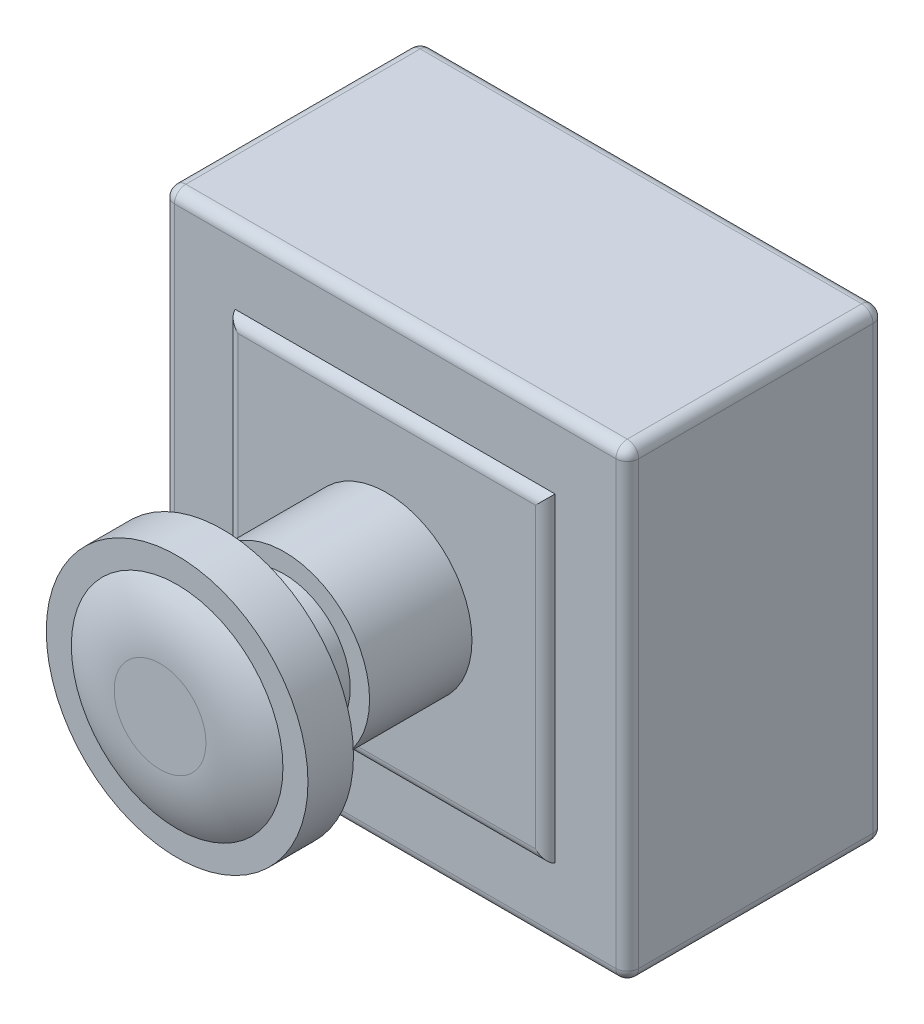
ISO-10303-21;
HEADER;
FILE_DESCRIPTION(('STEP AP214'),'2;1');
FILE_NAME('part.step','',(''),(''),'','','');
FILE_SCHEMA(('AUTOMOTIVE_DESIGN { 1 0 10303 214 1 1 1 1 }'));
ENDSEC;
DATA;
#1=APPLICATION_CONTEXT('core data for automotive mechanical design processes');
#2=APPLICATION_PROTOCOL_DEFINITION('international standard','automotive_design',2000,#1);
#3=PRODUCT_CONTEXT('',#1,'mechanical');
#4=PRODUCT('Part','Part','',(#3));
#5=PRODUCT_RELATED_PRODUCT_CATEGORY('part','',(#4));
#6=PRODUCT_DEFINITION_FORMATION('','',#4);
#7=PRODUCT_DEFINITION_CONTEXT('part definition',#1,'design');
#8=PRODUCT_DEFINITION('design','',#6,#7);
#9=PRODUCT_DEFINITION_SHAPE('','',#8);
#10=(LENGTH_UNIT() NAMED_UNIT(*) SI_UNIT(.MILLI.,.METRE.));
#11=(NAMED_UNIT(*) PLANE_ANGLE_UNIT() SI_UNIT($,.RADIAN.));
#12=(NAMED_UNIT(*) SI_UNIT($,.STERADIAN.) SOLID_ANGLE_UNIT());
#13=UNCERTAINTY_MEASURE_WITH_UNIT(LENGTH_MEASURE(1.E-05),#10,'distance_accuracy_value','');
#14=(GEOMETRIC_REPRESENTATION_CONTEXT(3) GLOBAL_UNCERTAINTY_ASSIGNED_CONTEXT((#13)) GLOBAL_UNIT_ASSIGNED_CONTEXT((#10,
#11,#12)) REPRESENTATION_CONTEXT('',''));
#15=CARTESIAN_POINT('',(0.,0.,0.));
#16=DIRECTION('',(0.,0.,1.));
#17=DIRECTION('',(1.,0.,0.));
#18=AXIS2_PLACEMENT_3D('',#15,#16,#17);
#19=CARTESIAN_POINT('',(0.,0.,28.05));
#20=DIRECTION('',(0.,0.,-1.));
#21=DIRECTION('',(-1.,0.,0.));
#22=AXIS2_PLACEMENT_3D('',#19,#20,#21);
#23=CYLINDRICAL_SURFACE('',#22,5.8);
#24=CARTESIAN_POINT('',(0.,0.,21.05));
#25=DIRECTION('',(0.,0.,1.));
#26=DIRECTION('',(1.,0.,0.));
#27=AXIS2_PLACEMENT_3D('',#24,#25,#26);
#28=CIRCLE('',#27,5.8);
#29=CARTESIAN_POINT('',(5.8,0.,21.05));
#30=VERTEX_POINT('',#29);
#31=EDGE_CURVE('E203',#30,#30,#28,.T.);
#32=ORIENTED_EDGE('',*,*,#31,.T.);
#33=EDGE_LOOP('',(#32));
#34=FACE_BOUND('',#33,.T.);
#35=CARTESIAN_POINT('',(0.,0.,26.05));
#36=DIRECTION('',(0.,0.,1.));
#37=DIRECTION('',(1.,0.,0.));
#38=AXIS2_PLACEMENT_3D('',#35,#36,#37);
#39=CIRCLE('',#38,5.8);
#40=CARTESIAN_POINT('',(5.8,0.,26.05));
#41=VERTEX_POINT('',#40);
#42=EDGE_CURVE('E212',#41,#41,#39,.T.);
#43=ORIENTED_EDGE('',*,*,#42,.F.);
#44=EDGE_LOOP('',(#43));
#45=FACE_BOUND('',#44,.T.);
#46=ADVANCED_FACE('F41',(#34,#45),#23,.T.);
#47=CARTESIAN_POINT('',(0.,0.,11.3));
#48=DIRECTION('',(0.,0.,1.));
#49=DIRECTION('',(1.,0.,0.));
#50=AXIS2_PLACEMENT_3D('',#47,#48,#49);
#51=PLANE('',#50);
#52=DIRECTION('',(0.,-1.,0.));
#53=VECTOR('',#52,1.);
#54=CARTESIAN_POINT('',(-19.4,-20.4,11.3));
#55=LINE('',#54,#53);
#56=CARTESIAN_POINT('',(-19.4,19.4,11.3));
#57=VERTEX_POINT('',#56);
#58=CARTESIAN_POINT('',(-19.4,-19.4,11.3));
#59=VERTEX_POINT('',#58);
#60=EDGE_CURVE('E236',#57,#59,#55,.T.);
#61=ORIENTED_EDGE('',*,*,#60,.T.);
#62=DIRECTION('',(1.,0.,0.));
#63=VECTOR('',#62,1.);
#64=CARTESIAN_POINT('',(20.4,-19.4,11.3));
#65=LINE('',#64,#63);
#66=CARTESIAN_POINT('',(19.4,-19.4,11.3));
#67=VERTEX_POINT('',#66);
#68=EDGE_CURVE('E239',#59,#67,#65,.T.);
#69=ORIENTED_EDGE('',*,*,#68,.T.);
#70=DIRECTION('',(0.,1.,0.));
#71=VECTOR('',#70,1.);
#72=CARTESIAN_POINT('',(19.4,20.4,11.3));
#73=LINE('',#72,#71);
#74=CARTESIAN_POINT('',(19.4,19.4,11.3));
#75=VERTEX_POINT('',#74);
#76=EDGE_CURVE('E230',#67,#75,#73,.T.);
#77=ORIENTED_EDGE('',*,*,#76,.T.);
#78=DIRECTION('',(-1.,0.,0.));
#79=VECTOR('',#78,1.);
#80=CARTESIAN_POINT('',(-20.4,19.4,11.3));
#81=LINE('',#80,#79);
#82=EDGE_CURVE('E233',#75,#57,#81,.T.);
#83=ORIENTED_EDGE('',*,*,#82,.T.);
#84=EDGE_LOOP('',(#61,#69,#77,#83));
#85=FACE_BOUND('',#84,.T.);
#86=DIRECTION('',(1.,0.,0.));
#87=VECTOR('',#86,1.);
#88=CARTESIAN_POINT('',(0.,14.05,11.3));
#89=LINE('',#88,#87);
#90=CARTESIAN_POINT('',(-14.05,14.05,11.3));
#91=VERTEX_POINT('',#90);
#92=CARTESIAN_POINT('',(14.05,14.05,11.3));
#93=VERTEX_POINT('',#92);
#94=EDGE_CURVE('E185',#91,#93,#89,.T.);
#95=ORIENTED_EDGE('',*,*,#94,.T.);
#96=DIRECTION('',(0.,-1.,0.));
#97=VECTOR('',#96,1.);
#98=CARTESIAN_POINT('',(14.05,0.,11.3));
#99=LINE('',#98,#97);
#100=CARTESIAN_POINT('',(14.05,-14.05,11.3));
#101=VERTEX_POINT('',#100);
#102=EDGE_CURVE('E163',#93,#101,#99,.T.);
#103=ORIENTED_EDGE('',*,*,#102,.T.);
#104=DIRECTION('',(-1.,0.,0.));
#105=VECTOR('',#104,1.);
#106=CARTESIAN_POINT('',(0.,-14.05,11.3));
#107=LINE('',#106,#105);
#108=CARTESIAN_POINT('',(-14.05,-14.05,11.3));
#109=VERTEX_POINT('',#108);
#110=EDGE_CURVE('E174',#101,#109,#107,.T.);
#111=ORIENTED_EDGE('',*,*,#110,.T.);
#112=DIRECTION('',(0.,1.,0.));
#113=VECTOR('',#112,1.);
#114=CARTESIAN_POINT('',(-14.05,0.,11.3));
#115=LINE('',#114,#113);
#116=EDGE_CURVE('E181',#109,#91,#115,.T.);
#117=ORIENTED_EDGE('',*,*,#116,.T.);
#118=EDGE_LOOP('',(#95,#103,#111,#117));
#119=FACE_BOUND('',#118,.T.);
#120=ADVANCED_FACE('F183',(#85,#119),#51,.T.);
#121=CARTESIAN_POINT('',(20.4,20.4,11.3));
#122=DIRECTION('',(-1.,0.,0.));
#123=DIRECTION('',(0.,-1.,0.));
#124=AXIS2_PLACEMENT_3D('',#121,#122,#123);
#125=PLANE('',#124);
#126=DIRECTION('',(0.,1.,0.));
#127=VECTOR('',#126,1.);
#128=CARTESIAN_POINT('',(20.4,-20.4,10.3));
#129=LINE('',#128,#127);
#130=CARTESIAN_POINT('',(20.4,19.4,10.3));
#131=VERTEX_POINT('',#130);
#132=CARTESIAN_POINT('',(20.4,-19.4,10.3));
#133=VERTEX_POINT('',#132);
#134=EDGE_CURVE('E288',#131,#133,#129,.F.);
#135=ORIENTED_EDGE('',*,*,#134,.T.);
#136=DIRECTION('',(0.,0.,-1.));
#137=VECTOR('',#136,1.);
#138=CARTESIAN_POINT('',(20.4,-19.4,11.3));
#139=LINE('',#138,#137);
#140=CARTESIAN_POINT('',(20.4,-19.4,-10.3));
#141=VERTEX_POINT('',#140);
#142=EDGE_CURVE('E292',#133,#141,#139,.T.);
#143=ORIENTED_EDGE('',*,*,#142,.T.);
#144=DIRECTION('',(0.,1.,0.));
#145=VECTOR('',#144,1.);
#146=CARTESIAN_POINT('',(20.4,20.4,-10.3));
#147=LINE('',#146,#145);
#148=CARTESIAN_POINT('',(20.4,19.4,-10.3));
#149=VERTEX_POINT('',#148);
#150=EDGE_CURVE('E285',#141,#149,#147,.T.);
#151=ORIENTED_EDGE('',*,*,#150,.T.);
#152=DIRECTION('',(0.,0.,-1.));
#153=VECTOR('',#152,1.);
#154=CARTESIAN_POINT('',(20.4,19.4,11.3));
#155=LINE('',#154,#153);
#156=EDGE_CURVE('E282',#149,#131,#155,.F.);
#157=ORIENTED_EDGE('',*,*,#156,.T.);
#158=EDGE_LOOP('',(#135,#143,#151,#157));
#159=FACE_BOUND('',#158,.T.);
#160=ADVANCED_FACE('F445',(#159),#125,.F.);
#161=CARTESIAN_POINT('',(-20.4,20.4,11.3));
#162=DIRECTION('',(0.,-1.,0.));
#163=DIRECTION('',(0.,0.,-1.));
#164=AXIS2_PLACEMENT_3D('',#161,#162,#163);
#165=PLANE('',#164);
#166=DIRECTION('',(-1.,0.,0.));
#167=VECTOR('',#166,1.);
#168=CARTESIAN_POINT('',(20.4,20.4,10.3));
#169=LINE('',#168,#167);
#170=CARTESIAN_POINT('',(-19.4,20.4,10.3));
#171=VERTEX_POINT('',#170);
#172=CARTESIAN_POINT('',(19.4,20.4,10.3));
#173=VERTEX_POINT('',#172);
#174=EDGE_CURVE('E275',#171,#173,#169,.F.);
#175=ORIENTED_EDGE('',*,*,#174,.T.);
#176=DIRECTION('',(0.,0.,-1.));
#177=VECTOR('',#176,1.);
#178=CARTESIAN_POINT('',(19.4,20.4,11.3));
#179=LINE('',#178,#177);
#180=CARTESIAN_POINT('',(19.4,20.4,-10.3));
#181=VERTEX_POINT('',#180);
#182=EDGE_CURVE('E279',#173,#181,#179,.T.);
#183=ORIENTED_EDGE('',*,*,#182,.T.);
#184=DIRECTION('',(-1.,0.,0.));
#185=VECTOR('',#184,1.);
#186=CARTESIAN_POINT('',(-20.4,20.4,-10.3));
#187=LINE('',#186,#185);
#188=CARTESIAN_POINT('',(-19.4,20.4,-10.3));
#189=VERTEX_POINT('',#188);
#190=EDGE_CURVE('E272',#181,#189,#187,.T.);
#191=ORIENTED_EDGE('',*,*,#190,.T.);
#192=DIRECTION('',(0.,0.,-1.));
#193=VECTOR('',#192,1.);
#194=CARTESIAN_POINT('',(-19.4,20.4,11.3));
#195=LINE('',#194,#193);
#196=EDGE_CURVE('E269',#189,#171,#195,.F.);
#197=ORIENTED_EDGE('',*,*,#196,.T.);
#198=EDGE_LOOP('',(#175,#183,#191,#197));
#199=FACE_BOUND('',#198,.T.);
#200=ADVANCED_FACE('F561',(#199),#165,.F.);
#201=CARTESIAN_POINT('',(-20.4,20.4,11.3));
#202=DIRECTION('',(1.,0.,0.));
#203=DIRECTION('',(0.,1.,0.));
#204=AXIS2_PLACEMENT_3D('',#201,#202,#203);
#205=PLANE('',#204);
#206=DIRECTION('',(0.,-1.,0.));
#207=VECTOR('',#206,1.);
#208=CARTESIAN_POINT('',(-20.4,20.4,-10.3));
#209=LINE('',#208,#207);
#210=CARTESIAN_POINT('',(-20.4,19.4,-10.3));
#211=VERTEX_POINT('',#210);
#212=CARTESIAN_POINT('',(-20.4,-19.4,-10.3));
#213=VERTEX_POINT('',#212);
#214=EDGE_CURVE('E259',#211,#213,#209,.T.);
#215=ORIENTED_EDGE('',*,*,#214,.T.);
#216=DIRECTION('',(0.,0.,-1.));
#217=VECTOR('',#216,1.);
#218=CARTESIAN_POINT('',(-20.4,-19.4,11.3));
#219=LINE('',#218,#217);
#220=CARTESIAN_POINT('',(-20.4,-19.4,10.3));
#221=VERTEX_POINT('',#220);
#222=EDGE_CURVE('E266',#213,#221,#219,.F.);
#223=ORIENTED_EDGE('',*,*,#222,.T.);
#224=DIRECTION('',(0.,-1.,0.));
#225=VECTOR('',#224,1.);
#226=CARTESIAN_POINT('',(-20.4,20.4,10.3));
#227=LINE('',#226,#225);
#228=CARTESIAN_POINT('',(-20.4,19.4,10.3));
#229=VERTEX_POINT('',#228);
#230=EDGE_CURVE('E262',#221,#229,#227,.F.);
#231=ORIENTED_EDGE('',*,*,#230,.T.);
#232=DIRECTION('',(0.,0.,-1.));
#233=VECTOR('',#232,1.);
#234=CARTESIAN_POINT('',(-20.4,19.4,11.3));
#235=LINE('',#234,#233);
#236=EDGE_CURVE('E256',#229,#211,#235,.T.);
#237=ORIENTED_EDGE('',*,*,#236,.T.);
#238=EDGE_LOOP('',(#215,#223,#231,#237));
#239=FACE_BOUND('',#238,.T.);
#240=ADVANCED_FACE('F584',(#239),#205,.F.);
#241=CARTESIAN_POINT('',(-20.4,-20.4,11.3));
#242=DIRECTION('',(0.,1.,0.));
#243=DIRECTION('',(0.,0.,1.));
#244=AXIS2_PLACEMENT_3D('',#241,#242,#243);
#245=PLANE('',#244);
#246=DIRECTION('',(1.,0.,0.));
#247=VECTOR('',#246,1.);
#248=CARTESIAN_POINT('',(-20.4,-20.4,10.3));
#249=LINE('',#248,#247);
#250=CARTESIAN_POINT('',(19.4,-20.4,10.3));
#251=VERTEX_POINT('',#250);
#252=CARTESIAN_POINT('',(-19.4,-20.4,10.3));
#253=VERTEX_POINT('',#252);
#254=EDGE_CURVE('E249',#251,#253,#249,.F.);
#255=ORIENTED_EDGE('',*,*,#254,.T.);
#256=DIRECTION('',(0.,0.,-1.));
#257=VECTOR('',#256,1.);
#258=CARTESIAN_POINT('',(-19.4,-20.4,11.3));
#259=LINE('',#258,#257);
#260=CARTESIAN_POINT('',(-19.4,-20.4,-10.3));
#261=VERTEX_POINT('',#260);
#262=EDGE_CURVE('E253',#253,#261,#259,.T.);
#263=ORIENTED_EDGE('',*,*,#262,.T.);
#264=DIRECTION('',(1.,0.,0.));
#265=VECTOR('',#264,1.);
#266=CARTESIAN_POINT('',(-20.4,-20.4,-10.3));
#267=LINE('',#266,#265);
#268=CARTESIAN_POINT('',(19.4,-20.4,-10.3));
#269=VERTEX_POINT('',#268);
#270=EDGE_CURVE('E246',#261,#269,#267,.T.);
#271=ORIENTED_EDGE('',*,*,#270,.T.);
#272=DIRECTION('',(0.,0.,-1.));
#273=VECTOR('',#272,1.);
#274=CARTESIAN_POINT('',(19.4,-20.4,11.3));
#275=LINE('',#274,#273);
#276=EDGE_CURVE('E243',#269,#251,#275,.F.);
#277=ORIENTED_EDGE('',*,*,#276,.T.);
#278=EDGE_LOOP('',(#255,#263,#271,#277));
#279=FACE_BOUND('',#278,.T.);
#280=ADVANCED_FACE('F434',(#279),#245,.F.);
#281=CARTESIAN_POINT('',(0.,0.,-11.3));
#282=DIRECTION('',(0.,0.,1.));
#283=DIRECTION('',(1.,0.,0.));
#284=AXIS2_PLACEMENT_3D('',#281,#282,#283);
#285=PLANE('',#284);
#286=DIRECTION('',(1.,0.,0.));
#287=VECTOR('',#286,1.);
#288=CARTESIAN_POINT('',(0.,-19.4,-11.3));
#289=LINE('',#288,#287);
#290=CARTESIAN_POINT('',(19.4,-19.4,-11.3));
#291=VERTEX_POINT('',#290);
#292=CARTESIAN_POINT('',(-19.4,-19.4,-11.3));
#293=VERTEX_POINT('',#292);
#294=EDGE_CURVE('E295',#291,#293,#289,.F.);
#295=ORIENTED_EDGE('',*,*,#294,.T.);
#296=DIRECTION('',(0.,-1.,0.));
#297=VECTOR('',#296,1.);
#298=CARTESIAN_POINT('',(-19.4,0.,-11.3));
#299=LINE('',#298,#297);
#300=CARTESIAN_POINT('',(-19.4,19.4,-11.3));
#301=VERTEX_POINT('',#300);
#302=EDGE_CURVE('E11',#293,#301,#299,.F.);
#303=ORIENTED_EDGE('',*,*,#302,.T.);
#304=DIRECTION('',(-1.,0.,0.));
#305=VECTOR('',#304,1.);
#306=CARTESIAN_POINT('',(0.,19.4,-11.3));
#307=LINE('',#306,#305);
#308=CARTESIAN_POINT('',(19.4,19.4,-11.3));
#309=VERTEX_POINT('',#308);
#310=EDGE_CURVE('E51',#301,#309,#307,.F.);
#311=ORIENTED_EDGE('',*,*,#310,.T.);
#312=DIRECTION('',(0.,1.,0.));
#313=VECTOR('',#312,1.);
#314=CARTESIAN_POINT('',(19.4,0.,-11.3));
#315=LINE('',#314,#313);
#316=EDGE_CURVE('E298',#309,#291,#315,.F.);
#317=ORIENTED_EDGE('',*,*,#316,.T.);
#318=EDGE_LOOP('',(#295,#303,#311,#317));
#319=FACE_BOUND('',#318,.T.);
#320=CARTESIAN_POINT('',(9.4,11.9,-11.3));
#321=DIRECTION('',(0.,0.,1.));
#322=DIRECTION('',(1.,0.,0.));
#323=AXIS2_PLACEMENT_3D('',#320,#321,#322);
#324=CIRCLE('',#323,2.5);
#325=CARTESIAN_POINT('',(11.9,11.9,-11.3));
#326=VERTEX_POINT('',#325);
#327=EDGE_CURVE('E226',#326,#326,#324,.F.);
#328=ORIENTED_EDGE('',*,*,#327,.F.);
#329=EDGE_LOOP('',(#328));
#330=FACE_BOUND('',#329,.T.);
#331=ADVANCED_FACE('F426',(#319,#330),#285,.F.);
#332=CARTESIAN_POINT('',(0.,0.,12.05));
#333=DIRECTION('',(0.,0.,1.));
#334=DIRECTION('',(1.,0.,0.));
#335=AXIS2_PLACEMENT_3D('',#332,#333,#334);
#336=PLANE('',#335);
#337=CARTESIAN_POINT('',(0.,0.,12.05));
#338=DIRECTION('',(0.,0.,1.));
#339=DIRECTION('',(1.,0.,0.));
#340=AXIS2_PLACEMENT_3D('',#337,#338,#339);
#341=CIRCLE('',#340,7.5);
#342=CARTESIAN_POINT('',(7.5,0.,12.05));
#343=VERTEX_POINT('',#342);
#344=EDGE_CURVE('E403',#343,#343,#341,.T.);
#345=ORIENTED_EDGE('',*,*,#344,.F.);
#346=EDGE_LOOP('',(#345));
#347=FACE_BOUND('',#346,.T.);
#348=DIRECTION('',(-1.,0.,0.));
#349=VECTOR('',#348,1.);
#350=CARTESIAN_POINT('',(14.05,-13.0817541634481,12.05));
#351=LINE('',#350,#349);
#352=CARTESIAN_POINT('',(-13.0817541634481,-13.0817541634481,12.05));
#353=VERTEX_POINT('',#352);
#354=CARTESIAN_POINT('',(13.0817541634481,-13.0817541634481,12.05));
#355=VERTEX_POINT('',#354);
#356=EDGE_CURVE('E191',#353,#355,#351,.F.);
#357=ORIENTED_EDGE('',*,*,#356,.T.);
#358=DIRECTION('',(0.,-1.,0.));
#359=VECTOR('',#358,1.);
#360=CARTESIAN_POINT('',(13.0817541634481,14.05,12.05));
#361=LINE('',#360,#359);
#362=CARTESIAN_POINT('',(13.0817541634481,13.0817541634481,12.05));
#363=VERTEX_POINT('',#362);
#364=EDGE_CURVE('E166',#355,#363,#361,.F.);
#365=ORIENTED_EDGE('',*,*,#364,.T.);
#366=DIRECTION('',(1.,0.,0.));
#367=VECTOR('',#366,1.);
#368=CARTESIAN_POINT('',(-14.05,13.0817541634481,12.05));
#369=LINE('',#368,#367);
#370=CARTESIAN_POINT('',(-13.0817541634481,13.0817541634481,12.05));
#371=VERTEX_POINT('',#370);
#372=EDGE_CURVE('E198',#363,#371,#369,.F.);
#373=ORIENTED_EDGE('',*,*,#372,.T.);
#374=DIRECTION('',(0.,1.,0.));
#375=VECTOR('',#374,1.);
#376=CARTESIAN_POINT('',(-13.0817541634481,-14.05,12.05));
#377=LINE('',#376,#375);
#378=EDGE_CURVE('E187',#371,#353,#377,.F.);
#379=ORIENTED_EDGE('',*,*,#378,.T.);
#380=EDGE_LOOP('',(#357,#365,#373,#379));
#381=FACE_BOUND('',#380,.T.);
#382=ADVANCED_FACE('F424',(#347,#381),#336,.T.);
#383=CARTESIAN_POINT('',(-13.0817541634481,14.05,11.05));
#384=DIRECTION('',(0.,-1.,0.));
#385=DIRECTION('',(1.,0.,0.));
#386=AXIS2_PLACEMENT_3D('',#383,#384,#385);
#387=CYLINDRICAL_SURFACE('',#386,1.);
#388=CARTESIAN_POINT('',(-13.0817541634481,13.0817541634481,11.05));
#389=DIRECTION('',(-0.707106781186547,-0.707106781186548,0.));
#390=DIRECTION('',(0.707106781186548,-0.707106781186547,0.));
#391=AXIS2_PLACEMENT_3D('',#388,#389,#390);
#392=ELLIPSE('',#391,1.4142135623731,1.);
#393=EDGE_CURVE('E170',#91,#371,#392,.F.);
#394=ORIENTED_EDGE('',*,*,#393,.F.);
#395=ORIENTED_EDGE('',*,*,#116,.F.);
#396=CARTESIAN_POINT('',(-13.0817541634481,-13.0817541634481,11.05));
#397=DIRECTION('',(0.707106781186548,-0.707106781186547,0.));
#398=DIRECTION('',(-0.707106781186547,-0.707106781186548,0.));
#399=AXIS2_PLACEMENT_3D('',#396,#397,#398);
#400=ELLIPSE('',#399,1.41421356237309,1.);
#401=EDGE_CURVE('E177',#353,#109,#400,.T.);
#402=ORIENTED_EDGE('',*,*,#401,.F.);
#403=ORIENTED_EDGE('',*,*,#378,.F.);
#404=EDGE_LOOP('',(#394,#395,#402,#403));
#405=FACE_BOUND('',#404,.T.);
#406=ADVANCED_FACE('F419',(#405),#387,.T.);
#407=CARTESIAN_POINT('',(-14.05,-13.0817541634481,11.05));
#408=DIRECTION('',(1.,0.,0.));
#409=DIRECTION('',(0.,0.,-1.));
#410=AXIS2_PLACEMENT_3D('',#407,#408,#409);
#411=CYLINDRICAL_SURFACE('',#410,1.);
#412=ORIENTED_EDGE('',*,*,#401,.T.);
#413=ORIENTED_EDGE('',*,*,#110,.F.);
#414=CARTESIAN_POINT('',(13.0817541634481,-13.0817541634481,11.05));
#415=DIRECTION('',(0.707106781186547,0.707106781186548,0.));
#416=DIRECTION('',(0.707106781186548,-0.707106781186547,0.));
#417=AXIS2_PLACEMENT_3D('',#414,#415,#416);
#418=ELLIPSE('',#417,1.4142135623731,1.);
#419=EDGE_CURVE('E159',#355,#101,#418,.T.);
#420=ORIENTED_EDGE('',*,*,#419,.F.);
#421=ORIENTED_EDGE('',*,*,#356,.F.);
#422=EDGE_LOOP('',(#412,#413,#420,#421));
#423=FACE_BOUND('',#422,.T.);
#424=ADVANCED_FACE('F175',(#423),#411,.T.);
#425=CARTESIAN_POINT('',(-14.05,13.0817541634481,11.05));
#426=DIRECTION('',(-1.,0.,0.));
#427=DIRECTION('',(0.,0.,1.));
#428=AXIS2_PLACEMENT_3D('',#425,#426,#427);
#429=CYLINDRICAL_SURFACE('',#428,1.);
#430=ORIENTED_EDGE('',*,*,#393,.T.);
#431=ORIENTED_EDGE('',*,*,#372,.F.);
#432=CARTESIAN_POINT('',(13.0817541634481,13.0817541634481,11.05));
#433=DIRECTION('',(-0.707106781186548,0.707106781186547,0.));
#434=DIRECTION('',(-0.707106781186547,-0.707106781186548,0.));
#435=AXIS2_PLACEMENT_3D('',#432,#433,#434);
#436=ELLIPSE('',#435,1.41421356237309,1.);
#437=EDGE_CURVE('E171',#93,#363,#436,.F.);
#438=ORIENTED_EDGE('',*,*,#437,.F.);
#439=ORIENTED_EDGE('',*,*,#94,.F.);
#440=EDGE_LOOP('',(#430,#431,#438,#439));
#441=FACE_BOUND('',#440,.T.);
#442=ADVANCED_FACE('F422',(#441),#429,.T.);
#443=CARTESIAN_POINT('',(13.0817541634481,14.05,11.05));
#444=DIRECTION('',(0.,1.,0.));
#445=DIRECTION('',(-1.,0.,0.));
#446=AXIS2_PLACEMENT_3D('',#443,#444,#445);
#447=CYLINDRICAL_SURFACE('',#446,1.);
#448=ORIENTED_EDGE('',*,*,#419,.T.);
#449=ORIENTED_EDGE('',*,*,#102,.F.);
#450=ORIENTED_EDGE('',*,*,#437,.T.);
#451=ORIENTED_EDGE('',*,*,#364,.F.);
#452=EDGE_LOOP('',(#448,#449,#450,#451));
#453=FACE_BOUND('',#452,.T.);
#454=ADVANCED_FACE('F161',(#453),#447,.T.);
#455=CARTESIAN_POINT('',(0.,0.,21.05));
#456=DIRECTION('',(0.,0.,-1.));
#457=DIRECTION('',(-1.,0.,0.));
#458=AXIS2_PLACEMENT_3D('',#455,#456,#457);
#459=CYLINDRICAL_SURFACE('',#458,7.5);
#460=CARTESIAN_POINT('',(0.,0.,21.05));
#461=DIRECTION('',(0.,0.,1.));
#462=DIRECTION('',(1.,0.,0.));
#463=AXIS2_PLACEMENT_3D('',#460,#461,#462);
#464=CIRCLE('',#463,7.5);
#465=CARTESIAN_POINT('',(7.5,0.,21.05));
#466=VERTEX_POINT('',#465);
#467=EDGE_CURVE('E205',#466,#466,#464,.T.);
#468=ORIENTED_EDGE('',*,*,#467,.F.);
#469=EDGE_LOOP('',(#468));
#470=FACE_BOUND('',#469,.T.);
#471=ORIENTED_EDGE('',*,*,#344,.T.);
#472=EDGE_LOOP('',(#471));
#473=FACE_BOUND('',#472,.T.);
#474=ADVANCED_FACE('F454',(#470,#473),#459,.T.);
#475=CARTESIAN_POINT('',(0.,0.,21.05));
#476=DIRECTION('',(0.,0.,1.));
#477=DIRECTION('',(1.,0.,0.));
#478=AXIS2_PLACEMENT_3D('',#475,#476,#477);
#479=PLANE('',#478);
#480=ORIENTED_EDGE('',*,*,#31,.F.);
#481=EDGE_LOOP('',(#480));
#482=FACE_BOUND('',#481,.T.);
#483=ORIENTED_EDGE('',*,*,#467,.T.);
#484=EDGE_LOOP('',(#483));
#485=FACE_BOUND('',#484,.T.);
#486=ADVANCED_FACE('F452',(#482,#485),#479,.T.);
#487=CARTESIAN_POINT('',(-0.414239482200651,0.,30.05));
#488=DIRECTION('',(0.,0.,-1.));
#489=DIRECTION('',(-1.,0.,0.));
#490=AXIS2_PLACEMENT_3D('',#487,#488,#489);
#491=CYLINDRICAL_SURFACE('',#490,11.5);
#492=CARTESIAN_POINT('',(-0.414239482200651,0.,30.05));
#493=DIRECTION('',(0.,0.,1.));
#494=DIRECTION('',(1.,0.,0.));
#495=AXIS2_PLACEMENT_3D('',#492,#493,#494);
#496=CIRCLE('',#495,11.5);
#497=CARTESIAN_POINT('',(11.0857605177993,0.,30.05));
#498=VERTEX_POINT('',#497);
#499=EDGE_CURVE('E399',#498,#498,#496,.T.);
#500=ORIENTED_EDGE('',*,*,#499,.F.);
#501=EDGE_LOOP('',(#500));
#502=FACE_BOUND('',#501,.T.);
#503=CARTESIAN_POINT('',(-0.414239482200651,0.,26.05));
#504=DIRECTION('',(0.,0.,1.));
#505=DIRECTION('',(1.,0.,0.));
#506=AXIS2_PLACEMENT_3D('',#503,#504,#505);
#507=CIRCLE('',#506,11.5);
#508=CARTESIAN_POINT('',(11.0857605177993,0.,26.05));
#509=VERTEX_POINT('',#508);
#510=EDGE_CURVE('E221',#509,#509,#507,.T.);
#511=ORIENTED_EDGE('',*,*,#510,.T.);
#512=EDGE_LOOP('',(#511));
#513=FACE_BOUND('',#512,.T.);
#514=ADVANCED_FACE('F450',(#502,#513),#491,.T.);
#515=CARTESIAN_POINT('',(-0.414239482200651,0.,30.05));
#516=DIRECTION('',(0.,0.,1.));
#517=DIRECTION('',(1.,0.,0.));
#518=AXIS2_PLACEMENT_3D('',#515,#516,#517);
#519=PLANE('',#518);
#520=CARTESIAN_POINT('',(-0.414239482200651,0.,30.05));
#521=DIRECTION('',(0.,0.,1.));
#522=DIRECTION('',(1.,0.,0.));
#523=AXIS2_PLACEMENT_3D('',#520,#521,#522);
#524=CIRCLE('',#523,9.3);
#525=CARTESIAN_POINT('',(8.88576051779935,0.,30.05));
#526=VERTEX_POINT('',#525);
#527=EDGE_CURVE('E217',#526,#526,#524,.F.);
#528=ORIENTED_EDGE('',*,*,#527,.T.);
#529=EDGE_LOOP('',(#528));
#530=FACE_BOUND('',#529,.T.);
#531=ORIENTED_EDGE('',*,*,#499,.T.);
#532=EDGE_LOOP('',(#531));
#533=FACE_BOUND('',#532,.T.);
#534=ADVANCED_FACE('F662',(#530,#533),#519,.T.);
#535=CARTESIAN_POINT('',(-0.414239482200651,0.,26.05));
#536=DIRECTION('',(0.,0.,1.));
#537=DIRECTION('',(1.,0.,0.));
#538=AXIS2_PLACEMENT_3D('',#535,#536,#537);
#539=PLANE('',#538);
#540=ORIENTED_EDGE('',*,*,#42,.T.);
#541=EDGE_LOOP('',(#540));
#542=FACE_BOUND('',#541,.T.);
#543=ORIENTED_EDGE('',*,*,#510,.F.);
#544=EDGE_LOOP('',(#543));
#545=FACE_BOUND('',#544,.T.);
#546=ADVANCED_FACE('F654',(#542,#545),#539,.F.);
#547=CARTESIAN_POINT('',(-0.414239482200651,0.,31.55));
#548=DIRECTION('',(0.,0.,1.));
#549=DIRECTION('',(1.,0.,0.));
#550=AXIS2_PLACEMENT_3D('',#547,#548,#549);
#551=PLANE('',#550);
#552=CARTESIAN_POINT('',(-0.414239482200651,0.,31.55));
#553=DIRECTION('',(0.,0.,1.));
#554=DIRECTION('',(1.,0.,0.));
#555=AXIS2_PLACEMENT_3D('',#552,#553,#554);
#556=CIRCLE('',#555,4.03217312357364);
#557=CARTESIAN_POINT('',(3.61793364137299,0.,31.55));
#558=VERTEX_POINT('',#557);
#559=EDGE_CURVE('E216',#558,#558,#556,.T.);
#560=ORIENTED_EDGE('',*,*,#559,.T.);
#561=EDGE_LOOP('',(#560));
#562=FACE_BOUND('',#561,.T.);
#563=ADVANCED_FACE('F478',(#562),#551,.T.);
#564=CARTESIAN_POINT('',(-0.414239482200651,0.,21.55));
#565=DIRECTION('',(0.,0.,-1.));
#566=DIRECTION('',(-1.,0.,0.));
#567=AXIS2_PLACEMENT_3D('',#564,#565,#566);
#568=DEGENERATE_TOROIDAL_SURFACE('',#567,4.03217312357364,10.,.T.);
#569=ORIENTED_EDGE('',*,*,#527,.F.);
#570=EDGE_LOOP('',(#569));
#571=FACE_BOUND('',#570,.T.);
#572=ORIENTED_EDGE('',*,*,#559,.F.);
#573=EDGE_LOOP('',(#572));
#574=FACE_BOUND('',#573,.T.);
#575=ADVANCED_FACE('F474',(#571,#574),#568,.T.);
#576=CARTESIAN_POINT('',(9.4,11.9,-16.3));
#577=DIRECTION('',(0.,0.,1.));
#578=DIRECTION('',(1.,0.,0.));
#579=AXIS2_PLACEMENT_3D('',#576,#577,#578);
#580=CYLINDRICAL_SURFACE('',#579,2.5);
#581=CARTESIAN_POINT('',(9.4,11.9,-16.3));
#582=DIRECTION('',(0.,0.,-1.));
#583=DIRECTION('',(-1.,0.,0.));
#584=AXIS2_PLACEMENT_3D('',#581,#582,#583);
#585=CIRCLE('',#584,2.5);
#586=CARTESIAN_POINT('',(6.9,11.9,-16.3));
#587=VERTEX_POINT('',#586);
#588=EDGE_CURVE('E222',#587,#587,#585,.T.);
#589=ORIENTED_EDGE('',*,*,#588,.F.);
#590=EDGE_LOOP('',(#589));
#591=FACE_BOUND('',#590,.T.);
#592=ORIENTED_EDGE('',*,*,#327,.T.);
#593=EDGE_LOOP('',(#592));
#594=FACE_BOUND('',#593,.T.);
#595=ADVANCED_FACE('F477',(#591,#594),#580,.T.);
#596=CARTESIAN_POINT('',(9.4,11.9,-16.3));
#597=DIRECTION('',(0.,0.,-1.));
#598=DIRECTION('',(-1.,0.,0.));
#599=AXIS2_PLACEMENT_3D('',#596,#597,#598);
#600=PLANE('',#599);
#601=ORIENTED_EDGE('',*,*,#588,.T.);
#602=EDGE_LOOP('',(#601));
#603=FACE_BOUND('',#602,.T.);
#604=ADVANCED_FACE('F554',(#603),#600,.T.);
#605=CARTESIAN_POINT('',(-20.4,19.4,-10.3));
#606=DIRECTION('',(-1.,0.,0.));
#607=DIRECTION('',(0.,0.,1.));
#608=AXIS2_PLACEMENT_3D('',#605,#606,#607);
#609=CYLINDRICAL_SURFACE('',#608,1.);
#610=CARTESIAN_POINT('',(-19.4,19.4,-10.3));
#611=DIRECTION('',(-1.,0.,0.));
#612=DIRECTION('',(0.,0.,1.));
#613=AXIS2_PLACEMENT_3D('',#610,#611,#612);
#614=CIRCLE('',#613,1.);
#615=EDGE_CURVE('E45',#189,#301,#614,.T.);
#616=ORIENTED_EDGE('',*,*,#615,.F.);
#617=ORIENTED_EDGE('',*,*,#190,.F.);
#618=CARTESIAN_POINT('',(19.4,19.4,-10.3));
#619=DIRECTION('',(1.,0.,0.));
#620=DIRECTION('',(0.,0.,-1.));
#621=AXIS2_PLACEMENT_3D('',#618,#619,#620);
#622=CIRCLE('',#621,1.);
#623=EDGE_CURVE('E383',#309,#181,#622,.T.);
#624=ORIENTED_EDGE('',*,*,#623,.F.);
#625=ORIENTED_EDGE('',*,*,#310,.F.);
#626=EDGE_LOOP('',(#616,#617,#624,#625));
#627=FACE_BOUND('',#626,.T.);
#628=ADVANCED_FACE('F43',(#627),#609,.T.);
#629=CARTESIAN_POINT('',(-19.4,19.4,-10.3));
#630=DIRECTION('',(0.,0.,-1.));
#631=DIRECTION('',(-1.,0.,0.));
#632=AXIS2_PLACEMENT_3D('',#629,#630,#631);
#633=SPHERICAL_SURFACE('',#632,1.);
#634=CARTESIAN_POINT('',(-19.4,19.4,-10.3));
#635=DIRECTION('',(0.,0.,-1.));
#636=DIRECTION('',(-1.,0.,0.));
#637=AXIS2_PLACEMENT_3D('',#634,#635,#636);
#638=CIRCLE('',#637,1.);
#639=EDGE_CURVE('E378',#189,#211,#638,.F.);
#640=ORIENTED_EDGE('',*,*,#639,.F.);
#641=ORIENTED_EDGE('',*,*,#615,.T.);
#642=CARTESIAN_POINT('',(-19.4,19.4,-10.3));
#643=DIRECTION('',(0.,1.,0.));
#644=DIRECTION('',(0.,0.,1.));
#645=AXIS2_PLACEMENT_3D('',#642,#643,#644);
#646=CIRCLE('',#645,1.);
#647=EDGE_CURVE('E59',#211,#301,#646,.F.);
#648=ORIENTED_EDGE('',*,*,#647,.F.);
#649=EDGE_LOOP('',(#640,#641,#648));
#650=FACE_BOUND('',#649,.T.);
#651=ADVANCED_FACE('F549',(#650),#633,.T.);
#652=CARTESIAN_POINT('',(19.4,19.4,-10.3));
#653=DIRECTION('',(0.,1.,0.));
#654=DIRECTION('',(0.,0.,1.));
#655=AXIS2_PLACEMENT_3D('',#652,#653,#654);
#656=SPHERICAL_SURFACE('',#655,1.);
#657=CARTESIAN_POINT('',(19.4,19.4,-10.3));
#658=DIRECTION('',(0.,1.,0.));
#659=DIRECTION('',(0.,0.,1.));
#660=AXIS2_PLACEMENT_3D('',#657,#658,#659);
#661=CIRCLE('',#660,1.);
#662=EDGE_CURVE('E370',#309,#149,#661,.F.);
#663=ORIENTED_EDGE('',*,*,#662,.F.);
#664=ORIENTED_EDGE('',*,*,#623,.T.);
#665=CARTESIAN_POINT('',(19.4,19.4,-10.3));
#666=DIRECTION('',(0.,0.,-1.));
#667=DIRECTION('',(-1.,0.,0.));
#668=AXIS2_PLACEMENT_3D('',#665,#666,#667);
#669=CIRCLE('',#668,1.);
#670=EDGE_CURVE('E374',#149,#181,#669,.F.);
#671=ORIENTED_EDGE('',*,*,#670,.F.);
#672=EDGE_LOOP('',(#663,#664,#671));
#673=FACE_BOUND('',#672,.T.);
#674=ADVANCED_FACE('F547',(#673),#656,.T.);
#675=CARTESIAN_POINT('',(-19.4,20.4,-10.3));
#676=DIRECTION('',(0.,-1.,0.));
#677=DIRECTION('',(1.,0.,0.));
#678=AXIS2_PLACEMENT_3D('',#675,#676,#677);
#679=CYLINDRICAL_SURFACE('',#678,1.);
#680=ORIENTED_EDGE('',*,*,#647,.T.);
#681=ORIENTED_EDGE('',*,*,#302,.F.);
#682=CARTESIAN_POINT('',(-19.4,-19.4,-10.3));
#683=DIRECTION('',(0.,-1.,0.));
#684=DIRECTION('',(0.,0.,-1.));
#685=AXIS2_PLACEMENT_3D('',#682,#683,#684);
#686=CIRCLE('',#685,1.);
#687=EDGE_CURVE('E362',#213,#293,#686,.T.);
#688=ORIENTED_EDGE('',*,*,#687,.F.);
#689=ORIENTED_EDGE('',*,*,#214,.F.);
#690=EDGE_LOOP('',(#680,#681,#688,#689));
#691=FACE_BOUND('',#690,.T.);
#692=ADVANCED_FACE('F543',(#691),#679,.T.);
#693=CARTESIAN_POINT('',(-19.4,19.4,11.3));
#694=DIRECTION('',(0.,0.,-1.));
#695=DIRECTION('',(-1.,0.,0.));
#696=AXIS2_PLACEMENT_3D('',#693,#694,#695);
#697=CYLINDRICAL_SURFACE('',#696,1.);
#698=ORIENTED_EDGE('',*,*,#639,.T.);
#699=ORIENTED_EDGE('',*,*,#236,.F.);
#700=CARTESIAN_POINT('',(-19.4,19.4,10.3));
#701=DIRECTION('',(0.,0.,1.));
#702=DIRECTION('',(1.,0.,0.));
#703=AXIS2_PLACEMENT_3D('',#700,#701,#702);
#704=CIRCLE('',#703,1.);
#705=EDGE_CURVE('E358',#171,#229,#704,.T.);
#706=ORIENTED_EDGE('',*,*,#705,.F.);
#707=ORIENTED_EDGE('',*,*,#196,.F.);
#708=EDGE_LOOP('',(#698,#699,#706,#707));
#709=FACE_BOUND('',#708,.T.);
#710=ADVANCED_FACE('F539',(#709),#697,.T.);
#711=CARTESIAN_POINT('',(0.,19.4,10.3));
#712=DIRECTION('',(1.,0.,0.));
#713=DIRECTION('',(0.,0.,-1.));
#714=AXIS2_PLACEMENT_3D('',#711,#712,#713);
#715=CYLINDRICAL_SURFACE('',#714,1.);
#716=CARTESIAN_POINT('',(19.4,19.4,10.3));
#717=DIRECTION('',(1.,0.,0.));
#718=DIRECTION('',(0.,0.,-1.));
#719=AXIS2_PLACEMENT_3D('',#716,#717,#718);
#720=CIRCLE('',#719,1.);
#721=EDGE_CURVE('E350',#173,#75,#720,.T.);
#722=ORIENTED_EDGE('',*,*,#721,.F.);
#723=ORIENTED_EDGE('',*,*,#174,.F.);
#724=CARTESIAN_POINT('',(-19.4,19.4,10.3));
#725=DIRECTION('',(-1.,0.,0.));
#726=DIRECTION('',(0.,-1.,0.));
#727=AXIS2_PLACEMENT_3D('',#724,#725,#726);
#728=CIRCLE('',#727,1.);
#729=EDGE_CURVE('E354',#57,#171,#728,.T.);
#730=ORIENTED_EDGE('',*,*,#729,.F.);
#731=ORIENTED_EDGE('',*,*,#82,.F.);
#732=EDGE_LOOP('',(#722,#723,#730,#731));
#733=FACE_BOUND('',#732,.T.);
#734=ADVANCED_FACE('F535',(#733),#715,.T.);
#735=CARTESIAN_POINT('',(19.4,19.4,11.3));
#736=DIRECTION('',(0.,0.,-1.));
#737=DIRECTION('',(-1.,0.,0.));
#738=AXIS2_PLACEMENT_3D('',#735,#736,#737);
#739=CYLINDRICAL_SURFACE('',#738,1.);
#740=ORIENTED_EDGE('',*,*,#670,.T.);
#741=ORIENTED_EDGE('',*,*,#182,.F.);
#742=CARTESIAN_POINT('',(19.4,19.4,10.3));
#743=DIRECTION('',(0.,0.,1.));
#744=DIRECTION('',(1.,0.,0.));
#745=AXIS2_PLACEMENT_3D('',#742,#743,#744);
#746=CIRCLE('',#745,1.);
#747=EDGE_CURVE('E347',#131,#173,#746,.T.);
#748=ORIENTED_EDGE('',*,*,#747,.F.);
#749=ORIENTED_EDGE('',*,*,#156,.F.);
#750=EDGE_LOOP('',(#740,#741,#748,#749));
#751=FACE_BOUND('',#750,.T.);
#752=ADVANCED_FACE('F531',(#751),#739,.T.);
#753=CARTESIAN_POINT('',(19.4,20.4,-10.3));
#754=DIRECTION('',(0.,1.,0.));
#755=DIRECTION('',(-1.,0.,0.));
#756=AXIS2_PLACEMENT_3D('',#753,#754,#755);
#757=CYLINDRICAL_SURFACE('',#756,1.);
#758=ORIENTED_EDGE('',*,*,#662,.T.);
#759=ORIENTED_EDGE('',*,*,#150,.F.);
#760=CARTESIAN_POINT('',(19.4,-19.4,-10.3));
#761=DIRECTION('',(0.,-1.,0.));
#762=DIRECTION('',(0.,0.,-1.));
#763=AXIS2_PLACEMENT_3D('',#760,#761,#762);
#764=CIRCLE('',#763,1.);
#765=EDGE_CURVE('E343',#291,#141,#764,.T.);
#766=ORIENTED_EDGE('',*,*,#765,.F.);
#767=ORIENTED_EDGE('',*,*,#316,.F.);
#768=EDGE_LOOP('',(#758,#759,#766,#767));
#769=FACE_BOUND('',#768,.T.);
#770=ADVANCED_FACE('F527',(#769),#757,.T.);
#771=CARTESIAN_POINT('',(-20.4,-19.4,-10.3));
#772=DIRECTION('',(1.,0.,0.));
#773=DIRECTION('',(0.,0.,-1.));
#774=AXIS2_PLACEMENT_3D('',#771,#772,#773);
#775=CYLINDRICAL_SURFACE('',#774,1.);
#776=CARTESIAN_POINT('',(-19.4,-19.4,-10.3));
#777=DIRECTION('',(-1.,0.,0.));
#778=DIRECTION('',(0.,0.,1.));
#779=AXIS2_PLACEMENT_3D('',#776,#777,#778);
#780=CIRCLE('',#779,1.);
#781=EDGE_CURVE('E366',#293,#261,#780,.T.);
#782=ORIENTED_EDGE('',*,*,#781,.F.);
#783=ORIENTED_EDGE('',*,*,#294,.F.);
#784=CARTESIAN_POINT('',(19.4,-19.4,-10.3));
#785=DIRECTION('',(1.,0.,0.));
#786=DIRECTION('',(0.,0.,-1.));
#787=AXIS2_PLACEMENT_3D('',#784,#785,#786);
#788=CIRCLE('',#787,1.);
#789=EDGE_CURVE('E339',#269,#291,#788,.T.);
#790=ORIENTED_EDGE('',*,*,#789,.F.);
#791=ORIENTED_EDGE('',*,*,#270,.F.);
#792=EDGE_LOOP('',(#782,#783,#790,#791));
#793=FACE_BOUND('',#792,.T.);
#794=ADVANCED_FACE('F523',(#793),#775,.T.);
#795=CARTESIAN_POINT('',(-19.4,-19.4,-10.3));
#796=DIRECTION('',(0.,0.,-1.));
#797=DIRECTION('',(-1.,0.,0.));
#798=AXIS2_PLACEMENT_3D('',#795,#796,#797);
#799=SPHERICAL_SURFACE('',#798,1.);
#800=ORIENTED_EDGE('',*,*,#687,.T.);
#801=ORIENTED_EDGE('',*,*,#781,.T.);
#802=CARTESIAN_POINT('',(-19.4,-19.4,-10.3));
#803=DIRECTION('',(0.,0.,-1.));
#804=DIRECTION('',(-1.,0.,0.));
#805=AXIS2_PLACEMENT_3D('',#802,#803,#804);
#806=CIRCLE('',#805,1.);
#807=EDGE_CURVE('E335',#213,#261,#806,.F.);
#808=ORIENTED_EDGE('',*,*,#807,.F.);
#809=EDGE_LOOP('',(#800,#801,#808));
#810=FACE_BOUND('',#809,.T.);
#811=ADVANCED_FACE('F519',(#810),#799,.T.);
#812=CARTESIAN_POINT('',(-19.4,19.4,10.3));
#813=DIRECTION('',(0.,1.,0.));
#814=DIRECTION('',(0.,0.,1.));
#815=AXIS2_PLACEMENT_3D('',#812,#813,#814);
#816=SPHERICAL_SURFACE('',#815,1.);
#817=ORIENTED_EDGE('',*,*,#729,.T.);
#818=ORIENTED_EDGE('',*,*,#705,.T.);
#819=CARTESIAN_POINT('',(-19.4,19.4,10.3));
#820=DIRECTION('',(0.,1.,0.));
#821=DIRECTION('',(0.,0.,1.));
#822=AXIS2_PLACEMENT_3D('',#819,#820,#821);
#823=CIRCLE('',#822,1.);
#824=EDGE_CURVE('E332',#57,#229,#823,.F.);
#825=ORIENTED_EDGE('',*,*,#824,.F.);
#826=EDGE_LOOP('',(#817,#818,#825));
#827=FACE_BOUND('',#826,.T.);
#828=ADVANCED_FACE('F515',(#827),#816,.T.);
#829=CARTESIAN_POINT('',(19.4,19.4,10.3));
#830=DIRECTION('',(0.,1.,0.));
#831=DIRECTION('',(0.,0.,1.));
#832=AXIS2_PLACEMENT_3D('',#829,#830,#831);
#833=SPHERICAL_SURFACE('',#832,1.);
#834=ORIENTED_EDGE('',*,*,#747,.T.);
#835=ORIENTED_EDGE('',*,*,#721,.T.);
#836=CARTESIAN_POINT('',(19.4,19.4,10.3));
#837=DIRECTION('',(0.,1.,0.));
#838=DIRECTION('',(0.,0.,1.));
#839=AXIS2_PLACEMENT_3D('',#836,#837,#838);
#840=CIRCLE('',#839,1.);
#841=EDGE_CURVE('E328',#131,#75,#840,.F.);
#842=ORIENTED_EDGE('',*,*,#841,.F.);
#843=EDGE_LOOP('',(#834,#835,#842));
#844=FACE_BOUND('',#843,.T.);
#845=ADVANCED_FACE('F511',(#844),#833,.T.);
#846=CARTESIAN_POINT('',(19.4,-19.4,-10.3));
#847=DIRECTION('',(0.,0.,-1.));
#848=DIRECTION('',(-1.,0.,0.));
#849=AXIS2_PLACEMENT_3D('',#846,#847,#848);
#850=SPHERICAL_SURFACE('',#849,1.);
#851=ORIENTED_EDGE('',*,*,#789,.T.);
#852=ORIENTED_EDGE('',*,*,#765,.T.);
#853=CARTESIAN_POINT('',(19.4,-19.4,-10.3));
#854=DIRECTION('',(0.,0.,-1.));
#855=DIRECTION('',(-1.,0.,0.));
#856=AXIS2_PLACEMENT_3D('',#853,#854,#855);
#857=CIRCLE('',#856,1.);
#858=EDGE_CURVE('E324',#269,#141,#857,.F.);
#859=ORIENTED_EDGE('',*,*,#858,.F.);
#860=EDGE_LOOP('',(#851,#852,#859));
#861=FACE_BOUND('',#860,.T.);
#862=ADVANCED_FACE('F507',(#861),#850,.T.);
#863=CARTESIAN_POINT('',(-19.4,-19.4,11.3));
#864=DIRECTION('',(0.,0.,-1.));
#865=DIRECTION('',(-1.,0.,0.));
#866=AXIS2_PLACEMENT_3D('',#863,#864,#865);
#867=CYLINDRICAL_SURFACE('',#866,1.);
#868=ORIENTED_EDGE('',*,*,#807,.T.);
#869=ORIENTED_EDGE('',*,*,#262,.F.);
#870=CARTESIAN_POINT('',(-19.4,-19.4,10.3));
#871=DIRECTION('',(0.,0.,1.));
#872=DIRECTION('',(1.,0.,0.));
#873=AXIS2_PLACEMENT_3D('',#870,#871,#872);
#874=CIRCLE('',#873,1.);
#875=EDGE_CURVE('E320',#221,#253,#874,.T.);
#876=ORIENTED_EDGE('',*,*,#875,.F.);
#877=ORIENTED_EDGE('',*,*,#222,.F.);
#878=EDGE_LOOP('',(#868,#869,#876,#877));
#879=FACE_BOUND('',#878,.T.);
#880=ADVANCED_FACE('F503',(#879),#867,.T.);
#881=CARTESIAN_POINT('',(-19.4,0.,10.3));
#882=DIRECTION('',(0.,1.,0.));
#883=DIRECTION('',(-1.,0.,0.));
#884=AXIS2_PLACEMENT_3D('',#881,#882,#883);
#885=CYLINDRICAL_SURFACE('',#884,1.);
#886=ORIENTED_EDGE('',*,*,#824,.T.);
#887=ORIENTED_EDGE('',*,*,#230,.F.);
#888=CARTESIAN_POINT('',(-19.4,-19.4,10.3));
#889=DIRECTION('',(0.,-1.,0.));
#890=DIRECTION('',(0.,0.,-1.));
#891=AXIS2_PLACEMENT_3D('',#888,#889,#890);
#892=CIRCLE('',#891,1.);
#893=EDGE_CURVE('E316',#59,#221,#892,.T.);
#894=ORIENTED_EDGE('',*,*,#893,.F.);
#895=ORIENTED_EDGE('',*,*,#60,.F.);
#896=EDGE_LOOP('',(#886,#887,#894,#895));
#897=FACE_BOUND('',#896,.T.);
#898=ADVANCED_FACE('F499',(#897),#885,.T.);
#899=CARTESIAN_POINT('',(19.4,0.,10.3));
#900=DIRECTION('',(0.,-1.,0.));
#901=DIRECTION('',(1.,0.,0.));
#902=AXIS2_PLACEMENT_3D('',#899,#900,#901);
#903=CYLINDRICAL_SURFACE('',#902,1.);
#904=ORIENTED_EDGE('',*,*,#841,.T.);
#905=ORIENTED_EDGE('',*,*,#76,.F.);
#906=CARTESIAN_POINT('',(19.4,-19.4,10.3));
#907=DIRECTION('',(0.,-1.,0.));
#908=DIRECTION('',(0.,0.,-1.));
#909=AXIS2_PLACEMENT_3D('',#906,#907,#908);
#910=CIRCLE('',#909,1.);
#911=EDGE_CURVE('E312',#133,#67,#910,.T.);
#912=ORIENTED_EDGE('',*,*,#911,.F.);
#913=ORIENTED_EDGE('',*,*,#134,.F.);
#914=EDGE_LOOP('',(#904,#905,#912,#913));
#915=FACE_BOUND('',#914,.T.);
#916=ADVANCED_FACE('F495',(#915),#903,.T.);
#917=CARTESIAN_POINT('',(19.4,-19.4,11.3));
#918=DIRECTION('',(0.,0.,-1.));
#919=DIRECTION('',(-1.,0.,0.));
#920=AXIS2_PLACEMENT_3D('',#917,#918,#919);
#921=CYLINDRICAL_SURFACE('',#920,1.);
#922=ORIENTED_EDGE('',*,*,#858,.T.);
#923=ORIENTED_EDGE('',*,*,#142,.F.);
#924=CARTESIAN_POINT('',(19.4,-19.4,10.3));
#925=DIRECTION('',(0.,0.,1.));
#926=DIRECTION('',(1.,0.,0.));
#927=AXIS2_PLACEMENT_3D('',#924,#925,#926);
#928=CIRCLE('',#927,1.);
#929=EDGE_CURVE('E309',#251,#133,#928,.T.);
#930=ORIENTED_EDGE('',*,*,#929,.F.);
#931=ORIENTED_EDGE('',*,*,#276,.F.);
#932=EDGE_LOOP('',(#922,#923,#930,#931));
#933=FACE_BOUND('',#932,.T.);
#934=ADVANCED_FACE('F491',(#933),#921,.T.);
#935=CARTESIAN_POINT('',(-19.4,-19.4,10.3));
#936=DIRECTION('',(-1.,0.,0.));
#937=DIRECTION('',(0.,0.,1.));
#938=AXIS2_PLACEMENT_3D('',#935,#936,#937);
#939=SPHERICAL_SURFACE('',#938,1.);
#940=ORIENTED_EDGE('',*,*,#893,.T.);
#941=ORIENTED_EDGE('',*,*,#875,.T.);
#942=CARTESIAN_POINT('',(-19.4,-19.4,10.3));
#943=DIRECTION('',(-1.,0.,0.));
#944=DIRECTION('',(0.,0.,1.));
#945=AXIS2_PLACEMENT_3D('',#942,#943,#944);
#946=CIRCLE('',#945,1.);
#947=EDGE_CURVE('E306',#59,#253,#946,.F.);
#948=ORIENTED_EDGE('',*,*,#947,.F.);
#949=EDGE_LOOP('',(#940,#941,#948));
#950=FACE_BOUND('',#949,.T.);
#951=ADVANCED_FACE('F487',(#950),#939,.T.);
#952=CARTESIAN_POINT('',(19.4,-19.4,10.3));
#953=DIRECTION('',(1.,0.,0.));
#954=DIRECTION('',(0.,0.,-1.));
#955=AXIS2_PLACEMENT_3D('',#952,#953,#954);
#956=SPHERICAL_SURFACE('',#955,1.);
#957=ORIENTED_EDGE('',*,*,#929,.T.);
#958=ORIENTED_EDGE('',*,*,#911,.T.);
#959=CARTESIAN_POINT('',(19.4,-19.4,10.3));
#960=DIRECTION('',(1.,0.,0.));
#961=DIRECTION('',(0.,0.,-1.));
#962=AXIS2_PLACEMENT_3D('',#959,#960,#961);
#963=CIRCLE('',#962,1.);
#964=EDGE_CURVE('E303',#251,#67,#963,.F.);
#965=ORIENTED_EDGE('',*,*,#964,.F.);
#966=EDGE_LOOP('',(#957,#958,#965));
#967=FACE_BOUND('',#966,.T.);
#968=ADVANCED_FACE('F483',(#967),#956,.T.);
#969=CARTESIAN_POINT('',(0.,-19.4,10.3));
#970=DIRECTION('',(-1.,0.,0.));
#971=DIRECTION('',(0.,0.,1.));
#972=AXIS2_PLACEMENT_3D('',#969,#970,#971);
#973=CYLINDRICAL_SURFACE('',#972,1.);
#974=ORIENTED_EDGE('',*,*,#947,.T.);
#975=ORIENTED_EDGE('',*,*,#254,.F.);
#976=ORIENTED_EDGE('',*,*,#964,.T.);
#977=ORIENTED_EDGE('',*,*,#68,.F.);
#978=EDGE_LOOP('',(#974,#975,#976,#977));
#979=FACE_BOUND('',#978,.T.);
#980=ADVANCED_FACE('F480',(#979),#973,.T.);
#981=CLOSED_SHELL('',(#46,#120,#160,#200,#240,#280,#331,#382,#406,#424,#442,#454,#474,#486,#514,
#534,#546,#563,#575,#595,#604,#628,#651,#674,#692,#710,#734,#752,#770,#794,#811,#828,#845,#862,
#880,#898,#916,#934,#951,#968,#980));
#982=MANIFOLD_SOLID_BREP('B2',#981);
#983=ADVANCED_BREP_SHAPE_REPRESENTATION('',(#18,#982),#14);
#984=SHAPE_DEFINITION_REPRESENTATION(#9,#983);
ENDSEC;
END-ISO-10303-21;
